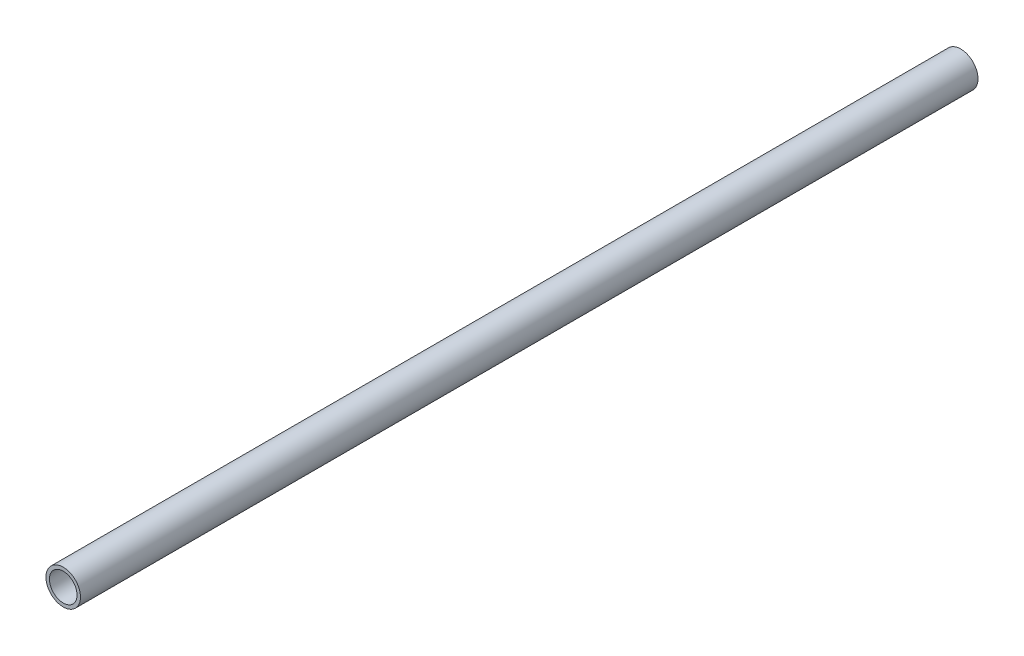
ISO-10303-21;
HEADER;
FILE_DESCRIPTION(('STEP AP214'),'2;1');
FILE_NAME('part.step','',(''),(''),'','','');
FILE_SCHEMA(('AUTOMOTIVE_DESIGN { 1 0 10303 214 1 1 1 1 }'));
ENDSEC;
DATA;
#1=APPLICATION_CONTEXT('core data for automotive mechanical design processes');
#2=APPLICATION_PROTOCOL_DEFINITION('international standard','automotive_design',2000,#1);
#3=PRODUCT_CONTEXT('',#1,'mechanical');
#4=PRODUCT('Part','Part','',(#3));
#5=PRODUCT_RELATED_PRODUCT_CATEGORY('part','',(#4));
#6=PRODUCT_DEFINITION_FORMATION('','',#4);
#7=PRODUCT_DEFINITION_CONTEXT('part definition',#1,'design');
#8=PRODUCT_DEFINITION('design','',#6,#7);
#9=PRODUCT_DEFINITION_SHAPE('','',#8);
#10=(LENGTH_UNIT() NAMED_UNIT(*) SI_UNIT(.MILLI.,.METRE.));
#11=(NAMED_UNIT(*) PLANE_ANGLE_UNIT() SI_UNIT($,.RADIAN.));
#12=(NAMED_UNIT(*) SI_UNIT($,.STERADIAN.) SOLID_ANGLE_UNIT());
#13=UNCERTAINTY_MEASURE_WITH_UNIT(LENGTH_MEASURE(1.E-05),#10,'distance_accuracy_value','');
#14=(GEOMETRIC_REPRESENTATION_CONTEXT(3) GLOBAL_UNCERTAINTY_ASSIGNED_CONTEXT((#13)) GLOBAL_UNIT_ASSIGNED_CONTEXT((#10,
#11,#12)) REPRESENTATION_CONTEXT('',''));
#15=CARTESIAN_POINT('',(0.,0.,0.));
#16=DIRECTION('',(0.,0.,1.));
#17=DIRECTION('',(1.,0.,0.));
#18=AXIS2_PLACEMENT_3D('',#15,#16,#17);
#19=CARTESIAN_POINT('',(0.,0.,520.));
#20=DIRECTION('',(0.,0.,1.));
#21=DIRECTION('',(1.,0.,0.));
#22=AXIS2_PLACEMENT_3D('',#19,#20,#21);
#23=PLANE('',#22);
#24=CARTESIAN_POINT('',(0.,0.,520.));
#25=DIRECTION('',(0.,0.,1.));
#26=DIRECTION('',(1.,0.,0.));
#27=AXIS2_PLACEMENT_3D('',#24,#25,#26);
#28=CIRCLE('',#27,10.);
#29=CARTESIAN_POINT('',(10.,0.,520.));
#30=VERTEX_POINT('',#29);
#31=EDGE_CURVE('E10',#30,#30,#28,.T.);
#32=ORIENTED_EDGE('',*,*,#31,.T.);
#33=EDGE_LOOP('',(#32));
#34=FACE_BOUND('',#33,.T.);
#35=CARTESIAN_POINT('',(0.,0.,520.));
#36=DIRECTION('',(0.,0.,1.));
#37=DIRECTION('',(1.,0.,0.));
#38=AXIS2_PLACEMENT_3D('',#35,#36,#37);
#39=CIRCLE('',#38,8.);
#40=CARTESIAN_POINT('',(8.,0.,520.));
#41=VERTEX_POINT('',#40);
#42=EDGE_CURVE('E48',#41,#41,#39,.T.);
#43=ORIENTED_EDGE('',*,*,#42,.F.);
#44=EDGE_LOOP('',(#43));
#45=FACE_BOUND('',#44,.T.);
#46=ADVANCED_FACE('F40',(#34,#45),#23,.T.);
#47=CARTESIAN_POINT('',(0.,0.,0.));
#48=DIRECTION('',(0.,0.,1.));
#49=DIRECTION('',(1.,0.,0.));
#50=AXIS2_PLACEMENT_3D('',#47,#48,#49);
#51=PLANE('',#50);
#52=CARTESIAN_POINT('',(0.,0.,0.));
#53=DIRECTION('',(0.,0.,1.));
#54=DIRECTION('',(1.,0.,0.));
#55=AXIS2_PLACEMENT_3D('',#52,#53,#54);
#56=CIRCLE('',#55,10.);
#57=CARTESIAN_POINT('',(10.,0.,0.));
#58=VERTEX_POINT('',#57);
#59=EDGE_CURVE('E41',#58,#58,#56,.T.);
#60=ORIENTED_EDGE('',*,*,#59,.F.);
#61=EDGE_LOOP('',(#60));
#62=FACE_BOUND('',#61,.T.);
#63=CARTESIAN_POINT('',(0.,0.,0.));
#64=DIRECTION('',(0.,0.,1.));
#65=DIRECTION('',(1.,0.,0.));
#66=AXIS2_PLACEMENT_3D('',#63,#64,#65);
#67=CIRCLE('',#66,8.);
#68=CARTESIAN_POINT('',(8.,0.,0.));
#69=VERTEX_POINT('',#68);
#70=EDGE_CURVE('E49',#69,#69,#67,.T.);
#71=ORIENTED_EDGE('',*,*,#70,.T.);
#72=EDGE_LOOP('',(#71));
#73=FACE_BOUND('',#72,.T.);
#74=ADVANCED_FACE('F58',(#62,#73),#51,.F.);
#75=CARTESIAN_POINT('',(0.,0.,520.));
#76=DIRECTION('',(0.,0.,-1.));
#77=DIRECTION('',(-1.,0.,0.));
#78=AXIS2_PLACEMENT_3D('',#75,#76,#77);
#79=CYLINDRICAL_SURFACE('',#78,10.);
#80=ORIENTED_EDGE('',*,*,#31,.F.);
#81=EDGE_LOOP('',(#80));
#82=FACE_BOUND('',#81,.T.);
#83=ORIENTED_EDGE('',*,*,#59,.T.);
#84=EDGE_LOOP('',(#83));
#85=FACE_BOUND('',#84,.T.);
#86=ADVANCED_FACE('F39',(#82,#85),#79,.T.);
#87=CARTESIAN_POINT('',(0.,0.,520.));
#88=DIRECTION('',(0.,0.,-1.));
#89=DIRECTION('',(-1.,0.,0.));
#90=AXIS2_PLACEMENT_3D('',#87,#88,#89);
#91=CYLINDRICAL_SURFACE('',#90,8.);
#92=ORIENTED_EDGE('',*,*,#42,.T.);
#93=EDGE_LOOP('',(#92));
#94=FACE_BOUND('',#93,.T.);
#95=ORIENTED_EDGE('',*,*,#70,.F.);
#96=EDGE_LOOP('',(#95));
#97=FACE_BOUND('',#96,.T.);
#98=ADVANCED_FACE('F57',(#94,#97),#91,.F.);
#99=CLOSED_SHELL('',(#46,#74,#86,#98));
#100=MANIFOLD_SOLID_BREP('B2',#99);
#101=ADVANCED_BREP_SHAPE_REPRESENTATION('',(#18,#100),#14);
#102=SHAPE_DEFINITION_REPRESENTATION(#9,#101);
ENDSEC;
END-ISO-10303-21;
